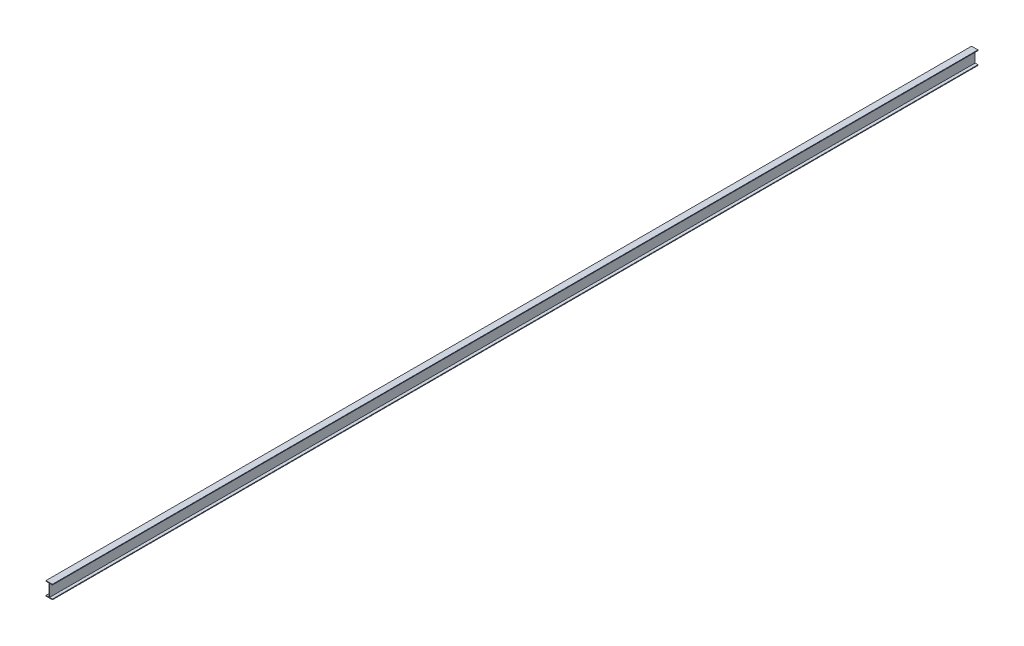
ISO-10303-21;
HEADER;
FILE_DESCRIPTION(('STEP AP214'),'2;1');
FILE_NAME('part.step','',(''),(''),'','','');
FILE_SCHEMA(('AUTOMOTIVE_DESIGN { 1 0 10303 214 1 1 1 1 }'));
ENDSEC;
DATA;
#1=APPLICATION_CONTEXT('core data for automotive mechanical design processes');
#2=APPLICATION_PROTOCOL_DEFINITION('international standard','automotive_design',2000,#1);
#3=PRODUCT_CONTEXT('',#1,'mechanical');
#4=PRODUCT('Part','Part','',(#3));
#5=PRODUCT_RELATED_PRODUCT_CATEGORY('part','',(#4));
#6=PRODUCT_DEFINITION_FORMATION('','',#4);
#7=PRODUCT_DEFINITION_CONTEXT('part definition',#1,'design');
#8=PRODUCT_DEFINITION('design','',#6,#7);
#9=PRODUCT_DEFINITION_SHAPE('','',#8);
#10=(LENGTH_UNIT() NAMED_UNIT(*) SI_UNIT(.MILLI.,.METRE.));
#11=(NAMED_UNIT(*) PLANE_ANGLE_UNIT() SI_UNIT($,.RADIAN.));
#12=(NAMED_UNIT(*) SI_UNIT($,.STERADIAN.) SOLID_ANGLE_UNIT());
#13=UNCERTAINTY_MEASURE_WITH_UNIT(LENGTH_MEASURE(1.E-05),#10,'distance_accuracy_value','');
#14=(GEOMETRIC_REPRESENTATION_CONTEXT(3) GLOBAL_UNCERTAINTY_ASSIGNED_CONTEXT((#13)) GLOBAL_UNIT_ASSIGNED_CONTEXT((#10,
#11,#12)) REPRESENTATION_CONTEXT('',''));
#15=CARTESIAN_POINT('',(0.,0.,0.));
#16=DIRECTION('',(0.,0.,1.));
#17=DIRECTION('',(1.,0.,0.));
#18=AXIS2_PLACEMENT_3D('',#15,#16,#17);
#19=CARTESIAN_POINT('',(-31.75,-130.175,9144.));
#20=DIRECTION('',(0.,1.,0.));
#21=DIRECTION('',(0.,0.,1.));
#22=AXIS2_PLACEMENT_3D('',#19,#20,#21);
#23=PLANE('',#22);
#24=DIRECTION('',(1.,0.,0.));
#25=VECTOR('',#24,1.);
#26=CARTESIAN_POINT('',(-31.75,-130.175,0.));
#27=LINE('',#26,#25);
#28=CARTESIAN_POINT('',(-31.75,-130.175,0.));
#29=VERTEX_POINT('',#28);
#30=CARTESIAN_POINT('',(31.75,-130.175,0.));
#31=VERTEX_POINT('',#30);
#32=EDGE_CURVE('E167',#29,#31,#27,.T.);
#33=ORIENTED_EDGE('',*,*,#32,.T.);
#34=DIRECTION('',(0.,0.,-1.));
#35=VECTOR('',#34,1.);
#36=CARTESIAN_POINT('',(31.75,-130.175,9144.));
#37=LINE('',#36,#35);
#38=CARTESIAN_POINT('',(31.75,-130.175,9144.));
#39=VERTEX_POINT('',#38);
#40=EDGE_CURVE('E13',#39,#31,#37,.T.);
#41=ORIENTED_EDGE('',*,*,#40,.F.);
#42=DIRECTION('',(1.,0.,0.));
#43=VECTOR('',#42,1.);
#44=CARTESIAN_POINT('',(-31.75,-130.175,9144.));
#45=LINE('',#44,#43);
#46=CARTESIAN_POINT('',(-31.75,-130.175,9144.));
#47=VERTEX_POINT('',#46);
#48=EDGE_CURVE('E144',#47,#39,#45,.T.);
#49=ORIENTED_EDGE('',*,*,#48,.F.);
#50=DIRECTION('',(0.,0.,-1.));
#51=VECTOR('',#50,1.);
#52=CARTESIAN_POINT('',(-31.75,-130.175,9144.));
#53=LINE('',#52,#51);
#54=EDGE_CURVE('E120',#47,#29,#53,.T.);
#55=ORIENTED_EDGE('',*,*,#54,.T.);
#56=EDGE_LOOP('',(#33,#41,#49,#55));
#57=FACE_BOUND('',#56,.T.);
#58=ADVANCED_FACE('F104',(#57),#23,.F.);
#59=CARTESIAN_POINT('',(31.75,-123.825,9144.));
#60=DIRECTION('',(1.,0.,0.));
#61=DIRECTION('',(0.,0.,-1.));
#62=AXIS2_PLACEMENT_3D('',#59,#60,#61);
#63=PLANE('',#62);
#64=DIRECTION('',(0.,-1.,0.));
#65=VECTOR('',#64,1.);
#66=CARTESIAN_POINT('',(31.75,-123.825,0.));
#67=LINE('',#66,#65);
#68=CARTESIAN_POINT('',(31.75,-123.825,0.));
#69=VERTEX_POINT('',#68);
#70=EDGE_CURVE('E153',#69,#31,#67,.T.);
#71=ORIENTED_EDGE('',*,*,#70,.F.);
#72=DIRECTION('',(0.,0.,-1.));
#73=VECTOR('',#72,1.);
#74=CARTESIAN_POINT('',(31.75,-123.825,9144.));
#75=LINE('',#74,#73);
#76=CARTESIAN_POINT('',(31.75,-123.825,9144.));
#77=VERTEX_POINT('',#76);
#78=EDGE_CURVE('E112',#77,#69,#75,.T.);
#79=ORIENTED_EDGE('',*,*,#78,.F.);
#80=DIRECTION('',(0.,-1.,0.));
#81=VECTOR('',#80,1.);
#82=CARTESIAN_POINT('',(31.75,-123.825,9144.));
#83=LINE('',#82,#81);
#84=EDGE_CURVE('E151',#77,#39,#83,.T.);
#85=ORIENTED_EDGE('',*,*,#84,.T.);
#86=ORIENTED_EDGE('',*,*,#40,.T.);
#87=EDGE_LOOP('',(#71,#79,#85,#86));
#88=FACE_BOUND('',#87,.T.);
#89=ADVANCED_FACE('F150',(#88),#63,.T.);
#90=CARTESIAN_POINT('',(-31.75,-123.825,9144.));
#91=DIRECTION('',(0.,1.,0.));
#92=DIRECTION('',(0.,0.,1.));
#93=AXIS2_PLACEMENT_3D('',#90,#91,#92);
#94=PLANE('',#93);
#95=DIRECTION('',(1.,0.,0.));
#96=VECTOR('',#95,1.);
#97=CARTESIAN_POINT('',(-31.75,-123.825,0.));
#98=LINE('',#97,#96);
#99=CARTESIAN_POINT('',(-31.75,-123.825,0.));
#100=VERTEX_POINT('',#99);
#101=EDGE_CURVE('E170',#100,#69,#98,.T.);
#102=ORIENTED_EDGE('',*,*,#101,.F.);
#103=DIRECTION('',(0.,0.,-1.));
#104=VECTOR('',#103,1.);
#105=CARTESIAN_POINT('',(-31.75,-123.825,9144.));
#106=LINE('',#105,#104);
#107=CARTESIAN_POINT('',(-31.75,-123.825,9144.));
#108=VERTEX_POINT('',#107);
#109=EDGE_CURVE('E133',#108,#100,#106,.T.);
#110=ORIENTED_EDGE('',*,*,#109,.F.);
#111=DIRECTION('',(1.,0.,0.));
#112=VECTOR('',#111,1.);
#113=CARTESIAN_POINT('',(-31.75,-123.825,9144.));
#114=LINE('',#113,#112);
#115=EDGE_CURVE('E159',#108,#77,#114,.T.);
#116=ORIENTED_EDGE('',*,*,#115,.T.);
#117=ORIENTED_EDGE('',*,*,#78,.T.);
#118=EDGE_LOOP('',(#102,#110,#116,#117));
#119=FACE_BOUND('',#118,.T.);
#120=ADVANCED_FACE('F161',(#119),#94,.T.);
#121=CARTESIAN_POINT('',(-31.75,-130.175,9144.));
#122=DIRECTION('',(-1.,0.,0.));
#123=DIRECTION('',(0.,0.,1.));
#124=AXIS2_PLACEMENT_3D('',#121,#122,#123);
#125=PLANE('',#124);
#126=DIRECTION('',(0.,1.,0.));
#127=VECTOR('',#126,1.);
#128=CARTESIAN_POINT('',(-31.75,-130.175,0.));
#129=LINE('',#128,#127);
#130=EDGE_CURVE('E172',#29,#100,#129,.T.);
#131=ORIENTED_EDGE('',*,*,#130,.F.);
#132=ORIENTED_EDGE('',*,*,#54,.F.);
#133=DIRECTION('',(0.,1.,0.));
#134=VECTOR('',#133,1.);
#135=CARTESIAN_POINT('',(-31.75,-130.175,9144.));
#136=LINE('',#135,#134);
#137=EDGE_CURVE('E162',#47,#108,#136,.T.);
#138=ORIENTED_EDGE('',*,*,#137,.T.);
#139=ORIENTED_EDGE('',*,*,#109,.T.);
#140=EDGE_LOOP('',(#131,#132,#138,#139));
#141=FACE_BOUND('',#140,.T.);
#142=ADVANCED_FACE('F178',(#141),#125,.T.);
#143=CARTESIAN_POINT('',(0.,0.,9144.));
#144=DIRECTION('',(0.,0.,-1.));
#145=DIRECTION('',(-1.,0.,0.));
#146=AXIS2_PLACEMENT_3D('',#143,#144,#145);
#147=PLANE('',#146);
#148=ORIENTED_EDGE('',*,*,#48,.T.);
#149=ORIENTED_EDGE('',*,*,#84,.F.);
#150=ORIENTED_EDGE('',*,*,#115,.F.);
#151=ORIENTED_EDGE('',*,*,#137,.F.);
#152=EDGE_LOOP('',(#148,#149,#150,#151));
#153=FACE_BOUND('',#152,.T.);
#154=ADVANCED_FACE('F158',(#153),#147,.F.);
#155=CARTESIAN_POINT('',(0.,0.,0.));
#156=DIRECTION('',(0.,0.,-1.));
#157=DIRECTION('',(-1.,0.,0.));
#158=AXIS2_PLACEMENT_3D('',#155,#156,#157);
#159=PLANE('',#158);
#160=ORIENTED_EDGE('',*,*,#32,.F.);
#161=ORIENTED_EDGE('',*,*,#130,.T.);
#162=ORIENTED_EDGE('',*,*,#101,.T.);
#163=ORIENTED_EDGE('',*,*,#70,.T.);
#164=EDGE_LOOP('',(#160,#161,#162,#163));
#165=FACE_BOUND('',#164,.T.);
#166=ADVANCED_FACE('F177',(#165),#159,.T.);
#167=CLOSED_SHELL('',(#58,#89,#120,#142,#154,#166));
#168=MANIFOLD_SOLID_BREP('B2',#167);
#169=CARTESIAN_POINT('',(-3.175,0.,9144.));
#170=DIRECTION('',(1.,0.,0.));
#171=DIRECTION('',(0.,0.,-1.));
#172=AXIS2_PLACEMENT_3D('',#169,#170,#171);
#173=PLANE('',#172);
#174=DIRECTION('',(0.,1.,0.));
#175=VECTOR('',#174,1.);
#176=CARTESIAN_POINT('',(-3.175,0.,0.));
#177=LINE('',#176,#175);
#178=CARTESIAN_POINT('',(-3.175,0.,0.));
#179=VERTEX_POINT('',#178);
#180=CARTESIAN_POINT('',(-3.175,-127.,0.));
#181=VERTEX_POINT('',#180);
#182=EDGE_CURVE('E329',#179,#181,#177,.F.);
#183=ORIENTED_EDGE('',*,*,#182,.T.);
#184=DIRECTION('',(0.,0.,-1.));
#185=VECTOR('',#184,1.);
#186=CARTESIAN_POINT('',(-3.175,-127.,9144.));
#187=LINE('',#186,#185);
#188=CARTESIAN_POINT('',(-3.175,-127.,9144.));
#189=VERTEX_POINT('',#188);
#190=EDGE_CURVE('E102',#189,#181,#187,.T.);
#191=ORIENTED_EDGE('',*,*,#190,.F.);
#192=DIRECTION('',(0.,1.,0.));
#193=VECTOR('',#192,1.);
#194=CARTESIAN_POINT('',(-3.175,0.,9144.));
#195=LINE('',#194,#193);
#196=CARTESIAN_POINT('',(-3.175,0.,9144.));
#197=VERTEX_POINT('',#196);
#198=EDGE_CURVE('E302',#197,#189,#195,.F.);
#199=ORIENTED_EDGE('',*,*,#198,.F.);
#200=DIRECTION('',(0.,0.,-1.));
#201=VECTOR('',#200,1.);
#202=CARTESIAN_POINT('',(-3.175,0.,9144.));
#203=LINE('',#202,#201);
#204=EDGE_CURVE('E278',#197,#179,#203,.T.);
#205=ORIENTED_EDGE('',*,*,#204,.T.);
#206=EDGE_LOOP('',(#183,#191,#199,#205));
#207=FACE_BOUND('',#206,.T.);
#208=ADVANCED_FACE('F261',(#207),#173,.F.);
#209=CARTESIAN_POINT('',(3.175,-127.,9144.));
#210=DIRECTION('',(0.,-1.,0.));
#211=DIRECTION('',(0.,0.,-1.));
#212=AXIS2_PLACEMENT_3D('',#209,#210,#211);
#213=PLANE('',#212);
#214=DIRECTION('',(-1.,0.,0.));
#215=VECTOR('',#214,1.);
#216=CARTESIAN_POINT('',(3.175,-127.,0.));
#217=LINE('',#216,#215);
#218=CARTESIAN_POINT('',(3.175,-127.,0.));
#219=VERTEX_POINT('',#218);
#220=EDGE_CURVE('E311',#219,#181,#217,.T.);
#221=ORIENTED_EDGE('',*,*,#220,.F.);
#222=DIRECTION('',(0.,0.,-1.));
#223=VECTOR('',#222,1.);
#224=CARTESIAN_POINT('',(3.175,-127.,9144.));
#225=LINE('',#224,#223);
#226=CARTESIAN_POINT('',(3.175,-127.,9144.));
#227=VERTEX_POINT('',#226);
#228=EDGE_CURVE('E270',#227,#219,#225,.T.);
#229=ORIENTED_EDGE('',*,*,#228,.F.);
#230=DIRECTION('',(-1.,0.,0.));
#231=VECTOR('',#230,1.);
#232=CARTESIAN_POINT('',(3.175,-127.,9144.));
#233=LINE('',#232,#231);
#234=EDGE_CURVE('E309',#227,#189,#233,.T.);
#235=ORIENTED_EDGE('',*,*,#234,.T.);
#236=ORIENTED_EDGE('',*,*,#190,.T.);
#237=EDGE_LOOP('',(#221,#229,#235,#236));
#238=FACE_BOUND('',#237,.T.);
#239=ADVANCED_FACE('F308',(#238),#213,.T.);
#240=CARTESIAN_POINT('',(3.175,0.,9144.));
#241=DIRECTION('',(1.,0.,0.));
#242=DIRECTION('',(0.,0.,-1.));
#243=AXIS2_PLACEMENT_3D('',#240,#241,#242);
#244=PLANE('',#243);
#245=DIRECTION('',(0.,1.,0.));
#246=VECTOR('',#245,1.);
#247=CARTESIAN_POINT('',(3.175,0.,0.));
#248=LINE('',#247,#246);
#249=CARTESIAN_POINT('',(3.175,0.,0.));
#250=VERTEX_POINT('',#249);
#251=EDGE_CURVE('E334',#250,#219,#248,.F.);
#252=ORIENTED_EDGE('',*,*,#251,.F.);
#253=DIRECTION('',(0.,0.,-1.));
#254=VECTOR('',#253,1.);
#255=CARTESIAN_POINT('',(3.175,0.,9144.));
#256=LINE('',#255,#254);
#257=CARTESIAN_POINT('',(3.175,0.,9144.));
#258=VERTEX_POINT('',#257);
#259=EDGE_CURVE('E291',#258,#250,#256,.T.);
#260=ORIENTED_EDGE('',*,*,#259,.F.);
#261=DIRECTION('',(0.,1.,0.));
#262=VECTOR('',#261,1.);
#263=CARTESIAN_POINT('',(3.175,0.,9144.));
#264=LINE('',#263,#262);
#265=EDGE_CURVE('E318',#258,#227,#264,.F.);
#266=ORIENTED_EDGE('',*,*,#265,.T.);
#267=ORIENTED_EDGE('',*,*,#228,.T.);
#268=EDGE_LOOP('',(#252,#260,#266,#267));
#269=FACE_BOUND('',#268,.T.);
#270=ADVANCED_FACE('F321',(#269),#244,.T.);
#271=CARTESIAN_POINT('',(-3.175,0.,9144.));
#272=DIRECTION('',(0.,1.,0.));
#273=DIRECTION('',(0.,0.,1.));
#274=AXIS2_PLACEMENT_3D('',#271,#272,#273);
#275=PLANE('',#274);
#276=DIRECTION('',(1.,0.,0.));
#277=VECTOR('',#276,1.);
#278=CARTESIAN_POINT('',(-3.175,0.,0.));
#279=LINE('',#278,#277);
#280=EDGE_CURVE('E337',#179,#250,#279,.T.);
#281=ORIENTED_EDGE('',*,*,#280,.F.);
#282=ORIENTED_EDGE('',*,*,#204,.F.);
#283=DIRECTION('',(1.,0.,0.));
#284=VECTOR('',#283,1.);
#285=CARTESIAN_POINT('',(-3.175,0.,9144.));
#286=LINE('',#285,#284);
#287=EDGE_CURVE('E323',#197,#258,#286,.T.);
#288=ORIENTED_EDGE('',*,*,#287,.T.);
#289=ORIENTED_EDGE('',*,*,#259,.T.);
#290=EDGE_LOOP('',(#281,#282,#288,#289));
#291=FACE_BOUND('',#290,.T.);
#292=ADVANCED_FACE('F347',(#291),#275,.T.);
#293=CARTESIAN_POINT('',(0.,0.,9144.));
#294=DIRECTION('',(0.,0.,1.));
#295=DIRECTION('',(1.,0.,0.));
#296=AXIS2_PLACEMENT_3D('',#293,#294,#295);
#297=PLANE('',#296);
#298=ORIENTED_EDGE('',*,*,#198,.T.);
#299=ORIENTED_EDGE('',*,*,#234,.F.);
#300=ORIENTED_EDGE('',*,*,#265,.F.);
#301=ORIENTED_EDGE('',*,*,#287,.F.);
#302=EDGE_LOOP('',(#298,#299,#300,#301));
#303=FACE_BOUND('',#302,.T.);
#304=ADVANCED_FACE('F317',(#303),#297,.T.);
#305=CARTESIAN_POINT('',(0.,0.,0.));
#306=DIRECTION('',(0.,0.,1.));
#307=DIRECTION('',(1.,0.,0.));
#308=AXIS2_PLACEMENT_3D('',#305,#306,#307);
#309=PLANE('',#308);
#310=ORIENTED_EDGE('',*,*,#182,.F.);
#311=ORIENTED_EDGE('',*,*,#280,.T.);
#312=ORIENTED_EDGE('',*,*,#251,.T.);
#313=ORIENTED_EDGE('',*,*,#220,.T.);
#314=EDGE_LOOP('',(#310,#311,#312,#313));
#315=FACE_BOUND('',#314,.T.);
#316=ADVANCED_FACE('F346',(#315),#309,.F.);
#317=CLOSED_SHELL('',(#208,#239,#270,#292,#304,#316));
#318=MANIFOLD_SOLID_BREP('B7',#317);
#319=CARTESIAN_POINT('',(-31.75,-3.175,9144.));
#320=DIRECTION('',(0.,1.,0.));
#321=DIRECTION('',(-1.,0.,0.));
#322=AXIS2_PLACEMENT_3D('',#319,#320,#321);
#323=PLANE('',#322);
#324=DIRECTION('',(1.,0.,0.));
#325=VECTOR('',#324,1.);
#326=CARTESIAN_POINT('',(-31.75,-3.175,0.));
#327=LINE('',#326,#325);
#328=CARTESIAN_POINT('',(-31.75,-3.175,0.));
#329=VERTEX_POINT('',#328);
#330=CARTESIAN_POINT('',(31.75,-3.175,0.));
#331=VERTEX_POINT('',#330);
#332=EDGE_CURVE('E484',#329,#331,#327,.T.);
#333=ORIENTED_EDGE('',*,*,#332,.T.);
#334=DIRECTION('',(0.,0.,-1.));
#335=VECTOR('',#334,1.);
#336=CARTESIAN_POINT('',(31.75,-3.175,9144.));
#337=LINE('',#336,#335);
#338=CARTESIAN_POINT('',(31.75,-3.175,9144.));
#339=VERTEX_POINT('',#338);
#340=EDGE_CURVE('E259',#339,#331,#337,.T.);
#341=ORIENTED_EDGE('',*,*,#340,.F.);
#342=DIRECTION('',(1.,0.,0.));
#343=VECTOR('',#342,1.);
#344=CARTESIAN_POINT('',(-31.75,-3.175,9144.));
#345=LINE('',#344,#343);
#346=CARTESIAN_POINT('',(-31.75,-3.175,9144.));
#347=VERTEX_POINT('',#346);
#348=EDGE_CURVE('E461',#347,#339,#345,.T.);
#349=ORIENTED_EDGE('',*,*,#348,.F.);
#350=DIRECTION('',(0.,0.,-1.));
#351=VECTOR('',#350,1.);
#352=CARTESIAN_POINT('',(-31.75,-3.175,9144.));
#353=LINE('',#352,#351);
#354=EDGE_CURVE('E437',#347,#329,#353,.T.);
#355=ORIENTED_EDGE('',*,*,#354,.T.);
#356=EDGE_LOOP('',(#333,#341,#349,#355));
#357=FACE_BOUND('',#356,.T.);
#358=ADVANCED_FACE('F421',(#357),#323,.F.);
#359=CARTESIAN_POINT('',(31.75,3.175,9144.));
#360=DIRECTION('',(1.,0.,0.));
#361=DIRECTION('',(0.,0.,-1.));
#362=AXIS2_PLACEMENT_3D('',#359,#360,#361);
#363=PLANE('',#362);
#364=DIRECTION('',(0.,-1.,0.));
#365=VECTOR('',#364,1.);
#366=CARTESIAN_POINT('',(31.75,3.175,0.));
#367=LINE('',#366,#365);
#368=CARTESIAN_POINT('',(31.75,3.175,0.));
#369=VERTEX_POINT('',#368);
#370=EDGE_CURVE('E470',#369,#331,#367,.T.);
#371=ORIENTED_EDGE('',*,*,#370,.F.);
#372=DIRECTION('',(0.,0.,-1.));
#373=VECTOR('',#372,1.);
#374=CARTESIAN_POINT('',(31.75,3.175,9144.));
#375=LINE('',#374,#373);
#376=CARTESIAN_POINT('',(31.75,3.175,9144.));
#377=VERTEX_POINT('',#376);
#378=EDGE_CURVE('E429',#377,#369,#375,.T.);
#379=ORIENTED_EDGE('',*,*,#378,.F.);
#380=DIRECTION('',(0.,-1.,0.));
#381=VECTOR('',#380,1.);
#382=CARTESIAN_POINT('',(31.75,3.175,9144.));
#383=LINE('',#382,#381);
#384=EDGE_CURVE('E468',#377,#339,#383,.T.);
#385=ORIENTED_EDGE('',*,*,#384,.T.);
#386=ORIENTED_EDGE('',*,*,#340,.T.);
#387=EDGE_LOOP('',(#371,#379,#385,#386));
#388=FACE_BOUND('',#387,.T.);
#389=ADVANCED_FACE('F467',(#388),#363,.T.);
#390=CARTESIAN_POINT('',(-31.75,3.175,9144.));
#391=DIRECTION('',(0.,1.,0.));
#392=DIRECTION('',(-1.,0.,0.));
#393=AXIS2_PLACEMENT_3D('',#390,#391,#392);
#394=PLANE('',#393);
#395=DIRECTION('',(1.,0.,0.));
#396=VECTOR('',#395,1.);
#397=CARTESIAN_POINT('',(-31.75,3.175,0.));
#398=LINE('',#397,#396);
#399=CARTESIAN_POINT('',(-31.75,3.175,0.));
#400=VERTEX_POINT('',#399);
#401=EDGE_CURVE('E487',#400,#369,#398,.T.);
#402=ORIENTED_EDGE('',*,*,#401,.F.);
#403=DIRECTION('',(0.,0.,-1.));
#404=VECTOR('',#403,1.);
#405=CARTESIAN_POINT('',(-31.75,3.175,9144.));
#406=LINE('',#405,#404);
#407=CARTESIAN_POINT('',(-31.75,3.175,9144.));
#408=VERTEX_POINT('',#407);
#409=EDGE_CURVE('E450',#408,#400,#406,.T.);
#410=ORIENTED_EDGE('',*,*,#409,.F.);
#411=DIRECTION('',(1.,0.,0.));
#412=VECTOR('',#411,1.);
#413=CARTESIAN_POINT('',(-31.75,3.175,9144.));
#414=LINE('',#413,#412);
#415=EDGE_CURVE('E476',#408,#377,#414,.T.);
#416=ORIENTED_EDGE('',*,*,#415,.T.);
#417=ORIENTED_EDGE('',*,*,#378,.T.);
#418=EDGE_LOOP('',(#402,#410,#416,#417));
#419=FACE_BOUND('',#418,.T.);
#420=ADVANCED_FACE('F478',(#419),#394,.T.);
#421=CARTESIAN_POINT('',(-31.75,-3.175,9144.));
#422=DIRECTION('',(-1.,0.,0.));
#423=DIRECTION('',(0.,0.,1.));
#424=AXIS2_PLACEMENT_3D('',#421,#422,#423);
#425=PLANE('',#424);
#426=DIRECTION('',(0.,1.,0.));
#427=VECTOR('',#426,1.);
#428=CARTESIAN_POINT('',(-31.75,-3.175,0.));
#429=LINE('',#428,#427);
#430=EDGE_CURVE('E489',#329,#400,#429,.T.);
#431=ORIENTED_EDGE('',*,*,#430,.F.);
#432=ORIENTED_EDGE('',*,*,#354,.F.);
#433=DIRECTION('',(0.,1.,0.));
#434=VECTOR('',#433,1.);
#435=CARTESIAN_POINT('',(-31.75,-3.175,9144.));
#436=LINE('',#435,#434);
#437=EDGE_CURVE('E479',#347,#408,#436,.T.);
#438=ORIENTED_EDGE('',*,*,#437,.T.);
#439=ORIENTED_EDGE('',*,*,#409,.T.);
#440=EDGE_LOOP('',(#431,#432,#438,#439));
#441=FACE_BOUND('',#440,.T.);
#442=ADVANCED_FACE('F495',(#441),#425,.T.);
#443=CARTESIAN_POINT('',(0.,0.,9144.));
#444=DIRECTION('',(0.,0.,-1.));
#445=DIRECTION('',(-1.,0.,0.));
#446=AXIS2_PLACEMENT_3D('',#443,#444,#445);
#447=PLANE('',#446);
#448=ORIENTED_EDGE('',*,*,#348,.T.);
#449=ORIENTED_EDGE('',*,*,#384,.F.);
#450=ORIENTED_EDGE('',*,*,#415,.F.);
#451=ORIENTED_EDGE('',*,*,#437,.F.);
#452=EDGE_LOOP('',(#448,#449,#450,#451));
#453=FACE_BOUND('',#452,.T.);
#454=ADVANCED_FACE('F475',(#453),#447,.F.);
#455=CARTESIAN_POINT('',(0.,0.,0.));
#456=DIRECTION('',(0.,0.,-1.));
#457=DIRECTION('',(-1.,0.,0.));
#458=AXIS2_PLACEMENT_3D('',#455,#456,#457);
#459=PLANE('',#458);
#460=ORIENTED_EDGE('',*,*,#332,.F.);
#461=ORIENTED_EDGE('',*,*,#430,.T.);
#462=ORIENTED_EDGE('',*,*,#401,.T.);
#463=ORIENTED_EDGE('',*,*,#370,.T.);
#464=EDGE_LOOP('',(#460,#461,#462,#463));
#465=FACE_BOUND('',#464,.T.);
#466=ADVANCED_FACE('F494',(#465),#459,.T.);
#467=CLOSED_SHELL('',(#358,#389,#420,#442,#454,#466));
#468=MANIFOLD_SOLID_BREP('B96',#467);
#469=ADVANCED_BREP_SHAPE_REPRESENTATION('',(#18,#168,#318,#468),#14);
#470=SHAPE_DEFINITION_REPRESENTATION(#9,#469);
ENDSEC;
END-ISO-10303-21;
